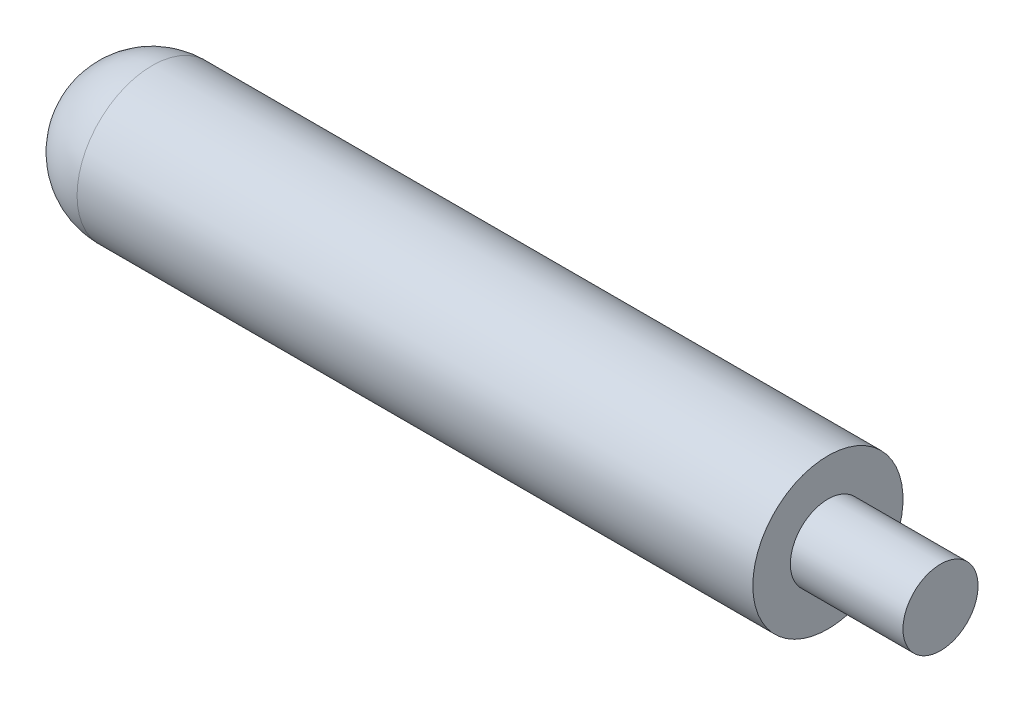
ISO-10303-21;
HEADER;
FILE_DESCRIPTION(('STEP AP214'),'2;1');
FILE_NAME('part.step','',(''),(''),'','','');
FILE_SCHEMA(('AUTOMOTIVE_DESIGN { 1 0 10303 214 1 1 1 1 }'));
ENDSEC;
DATA;
#1=APPLICATION_CONTEXT('core data for automotive mechanical design processes');
#2=APPLICATION_PROTOCOL_DEFINITION('international standard','automotive_design',2000,#1);
#3=PRODUCT_CONTEXT('',#1,'mechanical');
#4=PRODUCT('Part','Part','',(#3));
#5=PRODUCT_RELATED_PRODUCT_CATEGORY('part','',(#4));
#6=PRODUCT_DEFINITION_FORMATION('','',#4);
#7=PRODUCT_DEFINITION_CONTEXT('part definition',#1,'design');
#8=PRODUCT_DEFINITION('design','',#6,#7);
#9=PRODUCT_DEFINITION_SHAPE('','',#8);
#10=(LENGTH_UNIT() NAMED_UNIT(*) SI_UNIT(.MILLI.,.METRE.));
#11=(NAMED_UNIT(*) PLANE_ANGLE_UNIT() SI_UNIT($,.RADIAN.));
#12=(NAMED_UNIT(*) SI_UNIT($,.STERADIAN.) SOLID_ANGLE_UNIT());
#13=UNCERTAINTY_MEASURE_WITH_UNIT(LENGTH_MEASURE(1.E-05),#10,'distance_accuracy_value','');
#14=(GEOMETRIC_REPRESENTATION_CONTEXT(3) GLOBAL_UNCERTAINTY_ASSIGNED_CONTEXT((#13)) GLOBAL_UNIT_ASSIGNED_CONTEXT((#10,
#11,#12)) REPRESENTATION_CONTEXT('',''));
#15=CARTESIAN_POINT('',(0.,0.,0.));
#16=DIRECTION('',(0.,0.,1.));
#17=DIRECTION('',(1.,0.,0.));
#18=AXIS2_PLACEMENT_3D('',#15,#16,#17);
#19=CARTESIAN_POINT('',(0.,0.,0.));
#20=DIRECTION('',(-1.,0.,0.));
#21=DIRECTION('',(0.,0.,1.));
#22=AXIS2_PLACEMENT_3D('',#19,#20,#21);
#23=CYLINDRICAL_SURFACE('',#22,6.35);
#24=CARTESIAN_POINT('',(127.,0.,0.));
#25=DIRECTION('',(-1.,0.,0.));
#26=DIRECTION('',(0.,0.,1.));
#27=AXIS2_PLACEMENT_3D('',#24,#25,#26);
#28=CIRCLE('',#27,6.35);
#29=CARTESIAN_POINT('',(127.,0.,6.35));
#30=VERTEX_POINT('',#29);
#31=EDGE_CURVE('E10',#30,#30,#28,.T.);
#32=ORIENTED_EDGE('',*,*,#31,.F.);
#33=EDGE_LOOP('',(#32));
#34=FACE_BOUND('',#33,.T.);
#35=CARTESIAN_POINT('',(146.05,0.,0.));
#36=DIRECTION('',(-1.,0.,0.));
#37=DIRECTION('',(0.,0.,1.));
#38=AXIS2_PLACEMENT_3D('',#35,#36,#37);
#39=CIRCLE('',#38,6.35);
#40=CARTESIAN_POINT('',(146.05,0.,6.35));
#41=VERTEX_POINT('',#40);
#42=EDGE_CURVE('E42',#41,#41,#39,.T.);
#43=ORIENTED_EDGE('',*,*,#42,.T.);
#44=EDGE_LOOP('',(#43));
#45=FACE_BOUND('',#44,.T.);
#46=ADVANCED_FACE('F28',(#34,#45),#23,.T.);
#47=CARTESIAN_POINT('',(127.,6.35,0.));
#48=DIRECTION('',(-1.,0.,0.));
#49=DIRECTION('',(0.,0.,1.));
#50=AXIS2_PLACEMENT_3D('',#47,#48,#49);
#51=PLANE('',#50);
#52=CARTESIAN_POINT('',(127.,0.,0.));
#53=DIRECTION('',(-1.,0.,0.));
#54=DIRECTION('',(0.,0.,1.));
#55=AXIS2_PLACEMENT_3D('',#52,#53,#54);
#56=CIRCLE('',#55,12.7);
#57=CARTESIAN_POINT('',(127.,0.,12.7));
#58=VERTEX_POINT('',#57);
#59=EDGE_CURVE('E34',#58,#58,#56,.T.);
#60=ORIENTED_EDGE('',*,*,#59,.F.);
#61=EDGE_LOOP('',(#60));
#62=FACE_BOUND('',#61,.T.);
#63=ORIENTED_EDGE('',*,*,#31,.T.);
#64=EDGE_LOOP('',(#63));
#65=FACE_BOUND('',#64,.T.);
#66=ADVANCED_FACE('F60',(#62,#65),#51,.F.);
#67=CARTESIAN_POINT('',(0.,0.,0.));
#68=DIRECTION('',(-1.,0.,0.));
#69=DIRECTION('',(0.,0.,1.));
#70=AXIS2_PLACEMENT_3D('',#67,#68,#69);
#71=CYLINDRICAL_SURFACE('',#70,12.7);
#72=CARTESIAN_POINT('',(12.7,0.,0.));
#73=DIRECTION('',(-1.,0.,0.));
#74=DIRECTION('',(0.,0.,1.));
#75=AXIS2_PLACEMENT_3D('',#72,#73,#74);
#76=CIRCLE('',#75,12.7);
#77=CARTESIAN_POINT('',(12.7,0.,12.7));
#78=VERTEX_POINT('',#77);
#79=EDGE_CURVE('E38',#78,#78,#76,.T.);
#80=ORIENTED_EDGE('',*,*,#79,.F.);
#81=EDGE_LOOP('',(#80));
#82=FACE_BOUND('',#81,.T.);
#83=ORIENTED_EDGE('',*,*,#59,.T.);
#84=EDGE_LOOP('',(#83));
#85=FACE_BOUND('',#84,.T.);
#86=ADVANCED_FACE('F56',(#82,#85),#71,.T.);
#87=CARTESIAN_POINT('',(12.7,0.,0.));
#88=DIRECTION('',(-1.,0.,0.));
#89=DIRECTION('',(0.,1.,0.));
#90=AXIS2_PLACEMENT_3D('',#87,#88,#89);
#91=SPHERICAL_SURFACE('',#90,12.7);
#92=ORIENTED_EDGE('',*,*,#79,.T.);
#93=EDGE_LOOP('',(#92));
#94=FACE_BOUND('',#93,.T.);
#95=ADVANCED_FACE('F51',(#94),#91,.T.);
#96=CARTESIAN_POINT('',(146.05,0.,0.));
#97=DIRECTION('',(-1.,0.,0.));
#98=DIRECTION('',(0.,0.,1.));
#99=AXIS2_PLACEMENT_3D('',#96,#97,#98);
#100=PLANE('',#99);
#101=ORIENTED_EDGE('',*,*,#42,.F.);
#102=EDGE_LOOP('',(#101));
#103=FACE_BOUND('',#102,.T.);
#104=ADVANCED_FACE('F49',(#103),#100,.F.);
#105=CLOSED_SHELL('',(#46,#66,#86,#95,#104));
#106=MANIFOLD_SOLID_BREP('B2',#105);
#107=ADVANCED_BREP_SHAPE_REPRESENTATION('',(#18,#106),#14);
#108=SHAPE_DEFINITION_REPRESENTATION(#9,#107);
ENDSEC;
END-ISO-10303-21;
